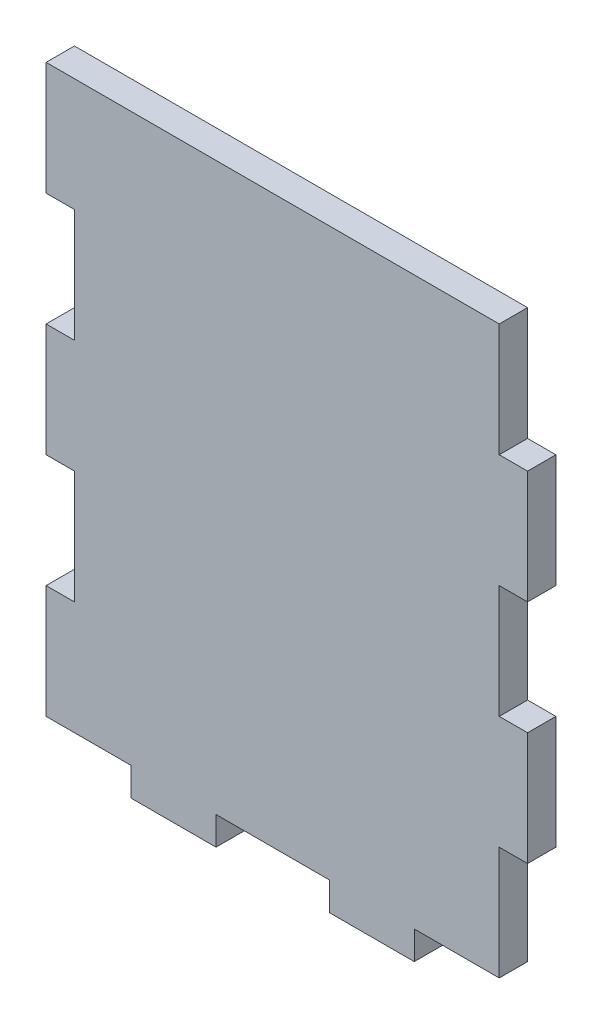
ISO-10303-21;
HEADER;
FILE_DESCRIPTION(('STEP AP214'),'2;1');
FILE_NAME('part.step','',(''),(''),'','','');
FILE_SCHEMA(('AUTOMOTIVE_DESIGN { 1 0 10303 214 1 1 1 1 }'));
ENDSEC;
DATA;
#1=APPLICATION_CONTEXT('core data for automotive mechanical design processes');
#2=APPLICATION_PROTOCOL_DEFINITION('international standard','automotive_design',2000,#1);
#3=PRODUCT_CONTEXT('',#1,'mechanical');
#4=PRODUCT('Part','Part','',(#3));
#5=PRODUCT_RELATED_PRODUCT_CATEGORY('part','',(#4));
#6=PRODUCT_DEFINITION_FORMATION('','',#4);
#7=PRODUCT_DEFINITION_CONTEXT('part definition',#1,'design');
#8=PRODUCT_DEFINITION('design','',#6,#7);
#9=PRODUCT_DEFINITION_SHAPE('','',#8);
#10=(LENGTH_UNIT() NAMED_UNIT(*) SI_UNIT(.MILLI.,.METRE.));
#11=(NAMED_UNIT(*) PLANE_ANGLE_UNIT() SI_UNIT($,.RADIAN.));
#12=(NAMED_UNIT(*) SI_UNIT($,.STERADIAN.) SOLID_ANGLE_UNIT());
#13=UNCERTAINTY_MEASURE_WITH_UNIT(LENGTH_MEASURE(1.E-05),#10,'distance_accuracy_value','');
#14=(GEOMETRIC_REPRESENTATION_CONTEXT(3) GLOBAL_UNCERTAINTY_ASSIGNED_CONTEXT((#13)) GLOBAL_UNIT_ASSIGNED_CONTEXT((#10,
#11,#12)) REPRESENTATION_CONTEXT('',''));
#15=CARTESIAN_POINT('',(0.,0.,0.));
#16=DIRECTION('',(0.,0.,1.));
#17=DIRECTION('',(1.,0.,0.));
#18=AXIS2_PLACEMENT_3D('',#15,#16,#17);
#19=CARTESIAN_POINT('',(-50.8,38.1,6.35));
#20=DIRECTION('',(-1.,0.,0.));
#21=DIRECTION('',(0.,0.,1.));
#22=AXIS2_PLACEMENT_3D('',#19,#20,#21);
#23=PLANE('',#22);
#24=DIRECTION('',(0.,1.,0.));
#25=VECTOR('',#24,1.);
#26=CARTESIAN_POINT('',(-50.8,38.1,0.));
#27=LINE('',#26,#25);
#28=CARTESIAN_POINT('',(-50.8,38.1,0.));
#29=VERTEX_POINT('',#28);
#30=CARTESIAN_POINT('',(-50.8,63.5,0.));
#31=VERTEX_POINT('',#30);
#32=EDGE_CURVE('E252',#29,#31,#27,.T.);
#33=ORIENTED_EDGE('',*,*,#32,.F.);
#34=DIRECTION('',(0.,0.,-1.));
#35=VECTOR('',#34,1.);
#36=CARTESIAN_POINT('',(-50.8,38.1,6.35));
#37=LINE('',#36,#35);
#38=CARTESIAN_POINT('',(-50.8,38.1,6.35));
#39=VERTEX_POINT('',#38);
#40=EDGE_CURVE('E11',#39,#29,#37,.T.);
#41=ORIENTED_EDGE('',*,*,#40,.F.);
#42=DIRECTION('',(0.,1.,0.));
#43=VECTOR('',#42,1.);
#44=CARTESIAN_POINT('',(-50.8,38.1,6.35));
#45=LINE('',#44,#43);
#46=CARTESIAN_POINT('',(-50.8,63.5,6.35));
#47=VERTEX_POINT('',#46);
#48=EDGE_CURVE('E322',#39,#47,#45,.T.);
#49=ORIENTED_EDGE('',*,*,#48,.T.);
#50=DIRECTION('',(0.,0.,-1.));
#51=VECTOR('',#50,1.);
#52=CARTESIAN_POINT('',(-50.8,63.5,6.35));
#53=LINE('',#52,#51);
#54=EDGE_CURVE('E36',#47,#31,#53,.T.);
#55=ORIENTED_EDGE('',*,*,#54,.T.);
#56=EDGE_LOOP('',(#33,#41,#49,#55));
#57=FACE_BOUND('',#56,.T.);
#58=ADVANCED_FACE('F33',(#57),#23,.T.);
#59=CARTESIAN_POINT('',(-50.8,38.1,6.35));
#60=DIRECTION('',(0.,1.,0.));
#61=DIRECTION('',(0.,0.,1.));
#62=AXIS2_PLACEMENT_3D('',#59,#60,#61);
#63=PLANE('',#62);
#64=DIRECTION('',(1.,0.,0.));
#65=VECTOR('',#64,1.);
#66=CARTESIAN_POINT('',(-50.8,38.1,0.));
#67=LINE('',#66,#65);
#68=CARTESIAN_POINT('',(-44.45,38.1,0.));
#69=VERTEX_POINT('',#68);
#70=EDGE_CURVE('E138',#29,#69,#67,.T.);
#71=ORIENTED_EDGE('',*,*,#70,.T.);
#72=DIRECTION('',(0.,0.,-1.));
#73=VECTOR('',#72,1.);
#74=CARTESIAN_POINT('',(-44.45,38.1,6.35));
#75=LINE('',#74,#73);
#76=CARTESIAN_POINT('',(-44.45,38.1,6.35));
#77=VERTEX_POINT('',#76);
#78=EDGE_CURVE('E42',#77,#69,#75,.T.);
#79=ORIENTED_EDGE('',*,*,#78,.F.);
#80=DIRECTION('',(1.,0.,0.));
#81=VECTOR('',#80,1.);
#82=CARTESIAN_POINT('',(-50.8,38.1,6.35));
#83=LINE('',#82,#81);
#84=EDGE_CURVE('E231',#39,#77,#83,.T.);
#85=ORIENTED_EDGE('',*,*,#84,.F.);
#86=ORIENTED_EDGE('',*,*,#40,.T.);
#87=EDGE_LOOP('',(#71,#79,#85,#86));
#88=FACE_BOUND('',#87,.T.);
#89=ADVANCED_FACE('F548',(#88),#63,.F.);
#90=CARTESIAN_POINT('',(-44.45,38.1,6.35));
#91=DIRECTION('',(1.,0.,0.));
#92=DIRECTION('',(0.,0.,-1.));
#93=AXIS2_PLACEMENT_3D('',#90,#91,#92);
#94=PLANE('',#93);
#95=DIRECTION('',(0.,-1.,0.));
#96=VECTOR('',#95,1.);
#97=CARTESIAN_POINT('',(-44.45,38.1,0.));
#98=LINE('',#97,#96);
#99=CARTESIAN_POINT('',(-44.45,12.7,0.));
#100=VERTEX_POINT('',#99);
#101=EDGE_CURVE('E238',#69,#100,#98,.T.);
#102=ORIENTED_EDGE('',*,*,#101,.T.);
#103=DIRECTION('',(0.,0.,-1.));
#104=VECTOR('',#103,1.);
#105=CARTESIAN_POINT('',(-44.45,12.7,6.35));
#106=LINE('',#105,#104);
#107=CARTESIAN_POINT('',(-44.45,12.7,6.35));
#108=VERTEX_POINT('',#107);
#109=EDGE_CURVE('E235',#108,#100,#106,.T.);
#110=ORIENTED_EDGE('',*,*,#109,.F.);
#111=DIRECTION('',(0.,-1.,0.));
#112=VECTOR('',#111,1.);
#113=CARTESIAN_POINT('',(-44.45,38.1,6.35));
#114=LINE('',#113,#112);
#115=EDGE_CURVE('E223',#77,#108,#114,.T.);
#116=ORIENTED_EDGE('',*,*,#115,.F.);
#117=ORIENTED_EDGE('',*,*,#78,.T.);
#118=EDGE_LOOP('',(#102,#110,#116,#117));
#119=FACE_BOUND('',#118,.T.);
#120=ADVANCED_FACE('F236',(#119),#94,.F.);
#121=CARTESIAN_POINT('',(-50.8,12.7,6.35));
#122=DIRECTION('',(0.,1.,0.));
#123=DIRECTION('',(0.,0.,1.));
#124=AXIS2_PLACEMENT_3D('',#121,#122,#123);
#125=PLANE('',#124);
#126=DIRECTION('',(1.,0.,0.));
#127=VECTOR('',#126,1.);
#128=CARTESIAN_POINT('',(-50.8,12.7,0.));
#129=LINE('',#128,#127);
#130=CARTESIAN_POINT('',(-50.8,12.7,0.));
#131=VERTEX_POINT('',#130);
#132=EDGE_CURVE('E319',#131,#100,#129,.T.);
#133=ORIENTED_EDGE('',*,*,#132,.F.);
#134=DIRECTION('',(0.,0.,-1.));
#135=VECTOR('',#134,1.);
#136=CARTESIAN_POINT('',(-50.8,12.7,6.35));
#137=LINE('',#136,#135);
#138=CARTESIAN_POINT('',(-50.8,12.7,6.35));
#139=VERTEX_POINT('',#138);
#140=EDGE_CURVE('E242',#139,#131,#137,.T.);
#141=ORIENTED_EDGE('',*,*,#140,.F.);
#142=DIRECTION('',(1.,0.,0.));
#143=VECTOR('',#142,1.);
#144=CARTESIAN_POINT('',(-50.8,12.7,6.35));
#145=LINE('',#144,#143);
#146=EDGE_CURVE('E229',#139,#108,#145,.T.);
#147=ORIENTED_EDGE('',*,*,#146,.T.);
#148=ORIENTED_EDGE('',*,*,#109,.T.);
#149=EDGE_LOOP('',(#133,#141,#147,#148));
#150=FACE_BOUND('',#149,.T.);
#151=ADVANCED_FACE('F244',(#150),#125,.T.);
#152=CARTESIAN_POINT('',(-50.8,-12.7,6.35));
#153=DIRECTION('',(-1.,0.,0.));
#154=DIRECTION('',(0.,0.,1.));
#155=AXIS2_PLACEMENT_3D('',#152,#153,#154);
#156=PLANE('',#155);
#157=DIRECTION('',(0.,1.,0.));
#158=VECTOR('',#157,1.);
#159=CARTESIAN_POINT('',(-50.8,-12.7,0.));
#160=LINE('',#159,#158);
#161=CARTESIAN_POINT('',(-50.8,-12.7,0.));
#162=VERTEX_POINT('',#161);
#163=EDGE_CURVE('E316',#162,#131,#160,.T.);
#164=ORIENTED_EDGE('',*,*,#163,.F.);
#165=DIRECTION('',(0.,0.,-1.));
#166=VECTOR('',#165,1.);
#167=CARTESIAN_POINT('',(-50.8,-12.7,6.35));
#168=LINE('',#167,#166);
#169=CARTESIAN_POINT('',(-50.8,-12.7,6.35));
#170=VERTEX_POINT('',#169);
#171=EDGE_CURVE('E326',#170,#162,#168,.T.);
#172=ORIENTED_EDGE('',*,*,#171,.F.);
#173=DIRECTION('',(0.,1.,0.));
#174=VECTOR('',#173,1.);
#175=CARTESIAN_POINT('',(-50.8,-12.7,6.35));
#176=LINE('',#175,#174);
#177=EDGE_CURVE('E245',#170,#139,#176,.T.);
#178=ORIENTED_EDGE('',*,*,#177,.T.);
#179=ORIENTED_EDGE('',*,*,#140,.T.);
#180=EDGE_LOOP('',(#164,#172,#178,#179));
#181=FACE_BOUND('',#180,.T.);
#182=ADVANCED_FACE('F387',(#181),#156,.T.);
#183=CARTESIAN_POINT('',(-50.8,-12.7,6.35));
#184=DIRECTION('',(0.,1.,0.));
#185=DIRECTION('',(0.,0.,1.));
#186=AXIS2_PLACEMENT_3D('',#183,#184,#185);
#187=PLANE('',#186);
#188=DIRECTION('',(1.,0.,0.));
#189=VECTOR('',#188,1.);
#190=CARTESIAN_POINT('',(-50.8,-12.7,0.));
#191=LINE('',#190,#189);
#192=CARTESIAN_POINT('',(-44.45,-12.7,0.));
#193=VERTEX_POINT('',#192);
#194=EDGE_CURVE('E314',#162,#193,#191,.T.);
#195=ORIENTED_EDGE('',*,*,#194,.T.);
#196=DIRECTION('',(0.,0.,-1.));
#197=VECTOR('',#196,1.);
#198=CARTESIAN_POINT('',(-44.45,-12.7,6.35));
#199=LINE('',#198,#197);
#200=CARTESIAN_POINT('',(-44.45,-12.7,6.35));
#201=VERTEX_POINT('',#200);
#202=EDGE_CURVE('E328',#201,#193,#199,.T.);
#203=ORIENTED_EDGE('',*,*,#202,.F.);
#204=DIRECTION('',(1.,0.,0.));
#205=VECTOR('',#204,1.);
#206=CARTESIAN_POINT('',(-50.8,-12.7,6.35));
#207=LINE('',#206,#205);
#208=EDGE_CURVE('E247',#170,#201,#207,.T.);
#209=ORIENTED_EDGE('',*,*,#208,.F.);
#210=ORIENTED_EDGE('',*,*,#171,.T.);
#211=EDGE_LOOP('',(#195,#203,#209,#210));
#212=FACE_BOUND('',#211,.T.);
#213=ADVANCED_FACE('F395',(#212),#187,.F.);
#214=CARTESIAN_POINT('',(-44.45,-12.7,6.35));
#215=DIRECTION('',(1.,0.,0.));
#216=DIRECTION('',(0.,1.,0.));
#217=AXIS2_PLACEMENT_3D('',#214,#215,#216);
#218=PLANE('',#217);
#219=DIRECTION('',(0.,-1.,0.));
#220=VECTOR('',#219,1.);
#221=CARTESIAN_POINT('',(-44.45,-12.7,0.));
#222=LINE('',#221,#220);
#223=CARTESIAN_POINT('',(-44.45,-38.1,0.));
#224=VERTEX_POINT('',#223);
#225=EDGE_CURVE('E311',#193,#224,#222,.T.);
#226=ORIENTED_EDGE('',*,*,#225,.T.);
#227=DIRECTION('',(0.,0.,-1.));
#228=VECTOR('',#227,1.);
#229=CARTESIAN_POINT('',(-44.45,-38.1,6.35));
#230=LINE('',#229,#228);
#231=CARTESIAN_POINT('',(-44.45,-38.1,6.35));
#232=VERTEX_POINT('',#231);
#233=EDGE_CURVE('E331',#232,#224,#230,.T.);
#234=ORIENTED_EDGE('',*,*,#233,.F.);
#235=DIRECTION('',(0.,-1.,0.));
#236=VECTOR('',#235,1.);
#237=CARTESIAN_POINT('',(-44.45,-12.7,6.35));
#238=LINE('',#237,#236);
#239=EDGE_CURVE('E392',#201,#232,#238,.T.);
#240=ORIENTED_EDGE('',*,*,#239,.F.);
#241=ORIENTED_EDGE('',*,*,#202,.T.);
#242=EDGE_LOOP('',(#226,#234,#240,#241));
#243=FACE_BOUND('',#242,.T.);
#244=ADVANCED_FACE('F397',(#243),#218,.F.);
#245=CARTESIAN_POINT('',(-50.8,-38.1,6.35));
#246=DIRECTION('',(0.,1.,0.));
#247=DIRECTION('',(0.,0.,1.));
#248=AXIS2_PLACEMENT_3D('',#245,#246,#247);
#249=PLANE('',#248);
#250=DIRECTION('',(1.,0.,0.));
#251=VECTOR('',#250,1.);
#252=CARTESIAN_POINT('',(-50.8,-38.1,0.));
#253=LINE('',#252,#251);
#254=CARTESIAN_POINT('',(-50.8,-38.1,0.));
#255=VERTEX_POINT('',#254);
#256=EDGE_CURVE('E308',#255,#224,#253,.T.);
#257=ORIENTED_EDGE('',*,*,#256,.F.);
#258=DIRECTION('',(0.,0.,-1.));
#259=VECTOR('',#258,1.);
#260=CARTESIAN_POINT('',(-50.8,-38.1,6.35));
#261=LINE('',#260,#259);
#262=CARTESIAN_POINT('',(-50.8,-38.1,6.35));
#263=VERTEX_POINT('',#262);
#264=EDGE_CURVE('E333',#263,#255,#261,.T.);
#265=ORIENTED_EDGE('',*,*,#264,.F.);
#266=DIRECTION('',(1.,0.,0.));
#267=VECTOR('',#266,1.);
#268=CARTESIAN_POINT('',(-50.8,-38.1,6.35));
#269=LINE('',#268,#267);
#270=EDGE_CURVE('E399',#263,#232,#269,.T.);
#271=ORIENTED_EDGE('',*,*,#270,.T.);
#272=ORIENTED_EDGE('',*,*,#233,.T.);
#273=EDGE_LOOP('',(#257,#265,#271,#272));
#274=FACE_BOUND('',#273,.T.);
#275=ADVANCED_FACE('F537',(#274),#249,.T.);
#276=CARTESIAN_POINT('',(-50.8,-63.5,6.35));
#277=DIRECTION('',(-1.,0.,0.));
#278=DIRECTION('',(0.,0.,1.));
#279=AXIS2_PLACEMENT_3D('',#276,#277,#278);
#280=PLANE('',#279);
#281=DIRECTION('',(0.,1.,0.));
#282=VECTOR('',#281,1.);
#283=CARTESIAN_POINT('',(-50.8,-63.5,0.));
#284=LINE('',#283,#282);
#285=CARTESIAN_POINT('',(-50.8,-63.5,0.));
#286=VERTEX_POINT('',#285);
#287=EDGE_CURVE('E305',#286,#255,#284,.T.);
#288=ORIENTED_EDGE('',*,*,#287,.F.);
#289=DIRECTION('',(0.,0.,-1.));
#290=VECTOR('',#289,1.);
#291=CARTESIAN_POINT('',(-50.8,-63.5,6.35));
#292=LINE('',#291,#290);
#293=CARTESIAN_POINT('',(-50.8,-63.5,6.35));
#294=VERTEX_POINT('',#293);
#295=EDGE_CURVE('E335',#294,#286,#292,.T.);
#296=ORIENTED_EDGE('',*,*,#295,.F.);
#297=DIRECTION('',(0.,1.,0.));
#298=VECTOR('',#297,1.);
#299=CARTESIAN_POINT('',(-50.8,-63.5,6.35));
#300=LINE('',#299,#298);
#301=EDGE_CURVE('E401',#294,#263,#300,.T.);
#302=ORIENTED_EDGE('',*,*,#301,.T.);
#303=ORIENTED_EDGE('',*,*,#264,.T.);
#304=EDGE_LOOP('',(#288,#296,#302,#303));
#305=FACE_BOUND('',#304,.T.);
#306=ADVANCED_FACE('F534',(#305),#280,.T.);
#307=CARTESIAN_POINT('',(-50.8,-63.5,6.35));
#308=DIRECTION('',(0.,1.,0.));
#309=DIRECTION('',(0.,0.,1.));
#310=AXIS2_PLACEMENT_3D('',#307,#308,#309);
#311=PLANE('',#310);
#312=DIRECTION('',(1.,0.,0.));
#313=VECTOR('',#312,1.);
#314=CARTESIAN_POINT('',(-50.8,-63.5,0.));
#315=LINE('',#314,#313);
#316=CARTESIAN_POINT('',(-31.75,-63.5,0.));
#317=VERTEX_POINT('',#316);
#318=EDGE_CURVE('E303',#286,#317,#315,.T.);
#319=ORIENTED_EDGE('',*,*,#318,.T.);
#320=DIRECTION('',(0.,0.,-1.));
#321=VECTOR('',#320,1.);
#322=CARTESIAN_POINT('',(-31.75,-63.5,6.35));
#323=LINE('',#322,#321);
#324=CARTESIAN_POINT('',(-31.75,-63.5,6.35));
#325=VERTEX_POINT('',#324);
#326=EDGE_CURVE('E337',#325,#317,#323,.T.);
#327=ORIENTED_EDGE('',*,*,#326,.F.);
#328=DIRECTION('',(1.,0.,0.));
#329=VECTOR('',#328,1.);
#330=CARTESIAN_POINT('',(-50.8,-63.5,6.35));
#331=LINE('',#330,#329);
#332=EDGE_CURVE('E406',#294,#325,#331,.T.);
#333=ORIENTED_EDGE('',*,*,#332,.F.);
#334=ORIENTED_EDGE('',*,*,#295,.T.);
#335=EDGE_LOOP('',(#319,#327,#333,#334));
#336=FACE_BOUND('',#335,.T.);
#337=ADVANCED_FACE('F530',(#336),#311,.F.);
#338=CARTESIAN_POINT('',(-31.75,-63.5,6.35));
#339=DIRECTION('',(1.,0.,0.));
#340=DIRECTION('',(0.,0.,-1.));
#341=AXIS2_PLACEMENT_3D('',#338,#339,#340);
#342=PLANE('',#341);
#343=DIRECTION('',(0.,-1.,0.));
#344=VECTOR('',#343,1.);
#345=CARTESIAN_POINT('',(-31.75,-63.5,0.));
#346=LINE('',#345,#344);
#347=CARTESIAN_POINT('',(-31.75,-69.85,0.));
#348=VERTEX_POINT('',#347);
#349=EDGE_CURVE('E301',#317,#348,#346,.T.);
#350=ORIENTED_EDGE('',*,*,#349,.T.);
#351=DIRECTION('',(0.,0.,-1.));
#352=VECTOR('',#351,1.);
#353=CARTESIAN_POINT('',(-31.75,-69.85,6.35));
#354=LINE('',#353,#352);
#355=CARTESIAN_POINT('',(-31.75,-69.85,6.35));
#356=VERTEX_POINT('',#355);
#357=EDGE_CURVE('E340',#356,#348,#354,.T.);
#358=ORIENTED_EDGE('',*,*,#357,.F.);
#359=DIRECTION('',(0.,-1.,0.));
#360=VECTOR('',#359,1.);
#361=CARTESIAN_POINT('',(-31.75,-63.5,6.35));
#362=LINE('',#361,#360);
#363=EDGE_CURVE('E408',#325,#356,#362,.T.);
#364=ORIENTED_EDGE('',*,*,#363,.F.);
#365=ORIENTED_EDGE('',*,*,#326,.T.);
#366=EDGE_LOOP('',(#350,#358,#364,#365));
#367=FACE_BOUND('',#366,.T.);
#368=ADVANCED_FACE('F526',(#367),#342,.F.);
#369=CARTESIAN_POINT('',(-31.75,-69.85,6.35));
#370=DIRECTION('',(0.,1.,0.));
#371=DIRECTION('',(0.,0.,1.));
#372=AXIS2_PLACEMENT_3D('',#369,#370,#371);
#373=PLANE('',#372);
#374=DIRECTION('',(1.,0.,0.));
#375=VECTOR('',#374,1.);
#376=CARTESIAN_POINT('',(-31.75,-69.85,0.));
#377=LINE('',#376,#375);
#378=CARTESIAN_POINT('',(-12.7,-69.85,0.));
#379=VERTEX_POINT('',#378);
#380=EDGE_CURVE('E298',#348,#379,#377,.T.);
#381=ORIENTED_EDGE('',*,*,#380,.T.);
#382=DIRECTION('',(0.,0.,-1.));
#383=VECTOR('',#382,1.);
#384=CARTESIAN_POINT('',(-12.7,-69.85,6.35));
#385=LINE('',#384,#383);
#386=CARTESIAN_POINT('',(-12.7,-69.85,6.35));
#387=VERTEX_POINT('',#386);
#388=EDGE_CURVE('E343',#387,#379,#385,.T.);
#389=ORIENTED_EDGE('',*,*,#388,.F.);
#390=DIRECTION('',(1.,0.,0.));
#391=VECTOR('',#390,1.);
#392=CARTESIAN_POINT('',(-31.75,-69.85,6.35));
#393=LINE('',#392,#391);
#394=EDGE_CURVE('E410',#356,#387,#393,.T.);
#395=ORIENTED_EDGE('',*,*,#394,.F.);
#396=ORIENTED_EDGE('',*,*,#357,.T.);
#397=EDGE_LOOP('',(#381,#389,#395,#396));
#398=FACE_BOUND('',#397,.T.);
#399=ADVANCED_FACE('F521',(#398),#373,.F.);
#400=CARTESIAN_POINT('',(-12.7,-63.5,6.35));
#401=DIRECTION('',(1.,0.,0.));
#402=DIRECTION('',(0.,0.,-1.));
#403=AXIS2_PLACEMENT_3D('',#400,#401,#402);
#404=PLANE('',#403);
#405=DIRECTION('',(0.,-1.,0.));
#406=VECTOR('',#405,1.);
#407=CARTESIAN_POINT('',(-12.7,-63.5,0.));
#408=LINE('',#407,#406);
#409=CARTESIAN_POINT('',(-12.7,-63.5,0.));
#410=VERTEX_POINT('',#409);
#411=EDGE_CURVE('E295',#410,#379,#408,.T.);
#412=ORIENTED_EDGE('',*,*,#411,.F.);
#413=DIRECTION('',(0.,0.,-1.));
#414=VECTOR('',#413,1.);
#415=CARTESIAN_POINT('',(-12.7,-63.5,6.35));
#416=LINE('',#415,#414);
#417=CARTESIAN_POINT('',(-12.7,-63.5,6.35));
#418=VERTEX_POINT('',#417);
#419=EDGE_CURVE('E345',#418,#410,#416,.T.);
#420=ORIENTED_EDGE('',*,*,#419,.F.);
#421=DIRECTION('',(0.,-1.,0.));
#422=VECTOR('',#421,1.);
#423=CARTESIAN_POINT('',(-12.7,-63.5,6.35));
#424=LINE('',#423,#422);
#425=EDGE_CURVE('E412',#418,#387,#424,.T.);
#426=ORIENTED_EDGE('',*,*,#425,.T.);
#427=ORIENTED_EDGE('',*,*,#388,.T.);
#428=EDGE_LOOP('',(#412,#420,#426,#427));
#429=FACE_BOUND('',#428,.T.);
#430=ADVANCED_FACE('F515',(#429),#404,.T.);
#431=CARTESIAN_POINT('',(-12.7,-63.5,6.35));
#432=DIRECTION('',(0.,1.,0.));
#433=DIRECTION('',(0.,0.,1.));
#434=AXIS2_PLACEMENT_3D('',#431,#432,#433);
#435=PLANE('',#434);
#436=DIRECTION('',(1.,0.,0.));
#437=VECTOR('',#436,1.);
#438=CARTESIAN_POINT('',(-12.7,-63.5,0.));
#439=LINE('',#438,#437);
#440=CARTESIAN_POINT('',(12.7,-63.5,0.));
#441=VERTEX_POINT('',#440);
#442=EDGE_CURVE('E293',#410,#441,#439,.T.);
#443=ORIENTED_EDGE('',*,*,#442,.T.);
#444=DIRECTION('',(0.,0.,-1.));
#445=VECTOR('',#444,1.);
#446=CARTESIAN_POINT('',(12.7,-63.5,6.35));
#447=LINE('',#446,#445);
#448=CARTESIAN_POINT('',(12.7,-63.5,6.35));
#449=VERTEX_POINT('',#448);
#450=EDGE_CURVE('E347',#449,#441,#447,.T.);
#451=ORIENTED_EDGE('',*,*,#450,.F.);
#452=DIRECTION('',(1.,0.,0.));
#453=VECTOR('',#452,1.);
#454=CARTESIAN_POINT('',(-12.7,-63.5,6.35));
#455=LINE('',#454,#453);
#456=EDGE_CURVE('E415',#418,#449,#455,.T.);
#457=ORIENTED_EDGE('',*,*,#456,.F.);
#458=ORIENTED_EDGE('',*,*,#419,.T.);
#459=EDGE_LOOP('',(#443,#451,#457,#458));
#460=FACE_BOUND('',#459,.T.);
#461=ADVANCED_FACE('F512',(#460),#435,.F.);
#462=CARTESIAN_POINT('',(12.7,-63.5,6.35));
#463=DIRECTION('',(1.,0.,0.));
#464=DIRECTION('',(0.,1.,0.));
#465=AXIS2_PLACEMENT_3D('',#462,#463,#464);
#466=PLANE('',#465);
#467=DIRECTION('',(0.,-1.,0.));
#468=VECTOR('',#467,1.);
#469=CARTESIAN_POINT('',(12.7,-63.5,0.));
#470=LINE('',#469,#468);
#471=CARTESIAN_POINT('',(12.7,-69.85,0.));
#472=VERTEX_POINT('',#471);
#473=EDGE_CURVE('E291',#441,#472,#470,.T.);
#474=ORIENTED_EDGE('',*,*,#473,.T.);
#475=DIRECTION('',(0.,0.,-1.));
#476=VECTOR('',#475,1.);
#477=CARTESIAN_POINT('',(12.7,-69.85,6.35));
#478=LINE('',#477,#476);
#479=CARTESIAN_POINT('',(12.7,-69.85,6.35));
#480=VERTEX_POINT('',#479);
#481=EDGE_CURVE('E350',#480,#472,#478,.T.);
#482=ORIENTED_EDGE('',*,*,#481,.F.);
#483=DIRECTION('',(0.,-1.,0.));
#484=VECTOR('',#483,1.);
#485=CARTESIAN_POINT('',(12.7,-63.5,6.35));
#486=LINE('',#485,#484);
#487=EDGE_CURVE('E417',#449,#480,#486,.T.);
#488=ORIENTED_EDGE('',*,*,#487,.F.);
#489=ORIENTED_EDGE('',*,*,#450,.T.);
#490=EDGE_LOOP('',(#474,#482,#488,#489));
#491=FACE_BOUND('',#490,.T.);
#492=ADVANCED_FACE('F507',(#491),#466,.F.);
#493=CARTESIAN_POINT('',(12.7,-69.85,6.35));
#494=DIRECTION('',(0.,1.,0.));
#495=DIRECTION('',(-1.,0.,0.));
#496=AXIS2_PLACEMENT_3D('',#493,#494,#495);
#497=PLANE('',#496);
#498=DIRECTION('',(1.,0.,0.));
#499=VECTOR('',#498,1.);
#500=CARTESIAN_POINT('',(12.7,-69.85,0.));
#501=LINE('',#500,#499);
#502=CARTESIAN_POINT('',(31.75,-69.85,0.));
#503=VERTEX_POINT('',#502);
#504=EDGE_CURVE('E288',#472,#503,#501,.T.);
#505=ORIENTED_EDGE('',*,*,#504,.T.);
#506=DIRECTION('',(0.,0.,-1.));
#507=VECTOR('',#506,1.);
#508=CARTESIAN_POINT('',(31.75,-69.85,6.35));
#509=LINE('',#508,#507);
#510=CARTESIAN_POINT('',(31.75,-69.85,6.35));
#511=VERTEX_POINT('',#510);
#512=EDGE_CURVE('E353',#511,#503,#509,.T.);
#513=ORIENTED_EDGE('',*,*,#512,.F.);
#514=DIRECTION('',(1.,0.,0.));
#515=VECTOR('',#514,1.);
#516=CARTESIAN_POINT('',(12.7,-69.85,6.35));
#517=LINE('',#516,#515);
#518=EDGE_CURVE('E419',#480,#511,#517,.T.);
#519=ORIENTED_EDGE('',*,*,#518,.F.);
#520=ORIENTED_EDGE('',*,*,#481,.T.);
#521=EDGE_LOOP('',(#505,#513,#519,#520));
#522=FACE_BOUND('',#521,.T.);
#523=ADVANCED_FACE('F501',(#522),#497,.F.);
#524=CARTESIAN_POINT('',(31.75,-63.5,6.35));
#525=DIRECTION('',(1.,0.,0.));
#526=DIRECTION('',(0.,0.,-1.));
#527=AXIS2_PLACEMENT_3D('',#524,#525,#526);
#528=PLANE('',#527);
#529=DIRECTION('',(0.,-1.,0.));
#530=VECTOR('',#529,1.);
#531=CARTESIAN_POINT('',(31.75,-63.5,0.));
#532=LINE('',#531,#530);
#533=CARTESIAN_POINT('',(31.75,-63.5,0.));
#534=VERTEX_POINT('',#533);
#535=EDGE_CURVE('E285',#534,#503,#532,.T.);
#536=ORIENTED_EDGE('',*,*,#535,.F.);
#537=DIRECTION('',(0.,0.,-1.));
#538=VECTOR('',#537,1.);
#539=CARTESIAN_POINT('',(31.75,-63.5,6.35));
#540=LINE('',#539,#538);
#541=CARTESIAN_POINT('',(31.75,-63.5,6.35));
#542=VERTEX_POINT('',#541);
#543=EDGE_CURVE('E355',#542,#534,#540,.T.);
#544=ORIENTED_EDGE('',*,*,#543,.F.);
#545=DIRECTION('',(0.,-1.,0.));
#546=VECTOR('',#545,1.);
#547=CARTESIAN_POINT('',(31.75,-63.5,6.35));
#548=LINE('',#547,#546);
#549=EDGE_CURVE('E421',#542,#511,#548,.T.);
#550=ORIENTED_EDGE('',*,*,#549,.T.);
#551=ORIENTED_EDGE('',*,*,#512,.T.);
#552=EDGE_LOOP('',(#536,#544,#550,#551));
#553=FACE_BOUND('',#552,.T.);
#554=ADVANCED_FACE('F495',(#553),#528,.T.);
#555=CARTESIAN_POINT('',(31.75,-63.5,6.35));
#556=DIRECTION('',(0.,1.,0.));
#557=DIRECTION('',(0.,0.,1.));
#558=AXIS2_PLACEMENT_3D('',#555,#556,#557);
#559=PLANE('',#558);
#560=DIRECTION('',(1.,0.,0.));
#561=VECTOR('',#560,1.);
#562=CARTESIAN_POINT('',(31.75,-63.5,0.));
#563=LINE('',#562,#561);
#564=CARTESIAN_POINT('',(50.8,-63.5,0.));
#565=VERTEX_POINT('',#564);
#566=EDGE_CURVE('E283',#534,#565,#563,.T.);
#567=ORIENTED_EDGE('',*,*,#566,.T.);
#568=DIRECTION('',(0.,0.,-1.));
#569=VECTOR('',#568,1.);
#570=CARTESIAN_POINT('',(50.8,-63.5,6.35));
#571=LINE('',#570,#569);
#572=CARTESIAN_POINT('',(50.8,-63.5,6.35));
#573=VERTEX_POINT('',#572);
#574=EDGE_CURVE('E357',#573,#565,#571,.T.);
#575=ORIENTED_EDGE('',*,*,#574,.F.);
#576=DIRECTION('',(1.,0.,0.));
#577=VECTOR('',#576,1.);
#578=CARTESIAN_POINT('',(31.75,-63.5,6.35));
#579=LINE('',#578,#577);
#580=EDGE_CURVE('E424',#542,#573,#579,.T.);
#581=ORIENTED_EDGE('',*,*,#580,.F.);
#582=ORIENTED_EDGE('',*,*,#543,.T.);
#583=EDGE_LOOP('',(#567,#575,#581,#582));
#584=FACE_BOUND('',#583,.T.);
#585=ADVANCED_FACE('F538',(#584),#559,.F.);
#586=CARTESIAN_POINT('',(50.8,-63.5,6.35));
#587=DIRECTION('',(-1.,0.,0.));
#588=DIRECTION('',(0.,0.,1.));
#589=AXIS2_PLACEMENT_3D('',#586,#587,#588);
#590=PLANE('',#589);
#591=DIRECTION('',(0.,1.,0.));
#592=VECTOR('',#591,1.);
#593=CARTESIAN_POINT('',(50.8,-63.5,0.));
#594=LINE('',#593,#592);
#595=CARTESIAN_POINT('',(50.8,-38.1,0.));
#596=VERTEX_POINT('',#595);
#597=EDGE_CURVE('E281',#565,#596,#594,.T.);
#598=ORIENTED_EDGE('',*,*,#597,.T.);
#599=DIRECTION('',(0.,0.,-1.));
#600=VECTOR('',#599,1.);
#601=CARTESIAN_POINT('',(50.8,-38.1,6.35));
#602=LINE('',#601,#600);
#603=CARTESIAN_POINT('',(50.8,-38.1,6.35));
#604=VERTEX_POINT('',#603);
#605=EDGE_CURVE('E360',#604,#596,#602,.T.);
#606=ORIENTED_EDGE('',*,*,#605,.F.);
#607=DIRECTION('',(0.,1.,0.));
#608=VECTOR('',#607,1.);
#609=CARTESIAN_POINT('',(50.8,-63.5,6.35));
#610=LINE('',#609,#608);
#611=EDGE_CURVE('E426',#573,#604,#610,.T.);
#612=ORIENTED_EDGE('',*,*,#611,.F.);
#613=ORIENTED_EDGE('',*,*,#574,.T.);
#614=EDGE_LOOP('',(#598,#606,#612,#613));
#615=FACE_BOUND('',#614,.T.);
#616=ADVANCED_FACE('F488',(#615),#590,.F.);
#617=CARTESIAN_POINT('',(50.8,-38.1,6.35));
#618=DIRECTION('',(0.,1.,0.));
#619=DIRECTION('',(0.,0.,1.));
#620=AXIS2_PLACEMENT_3D('',#617,#618,#619);
#621=PLANE('',#620);
#622=DIRECTION('',(1.,0.,0.));
#623=VECTOR('',#622,1.);
#624=CARTESIAN_POINT('',(50.8,-38.1,0.));
#625=LINE('',#624,#623);
#626=CARTESIAN_POINT('',(57.15,-38.1,0.));
#627=VERTEX_POINT('',#626);
#628=EDGE_CURVE('E278',#596,#627,#625,.T.);
#629=ORIENTED_EDGE('',*,*,#628,.T.);
#630=DIRECTION('',(0.,0.,-1.));
#631=VECTOR('',#630,1.);
#632=CARTESIAN_POINT('',(57.15,-38.1,6.35));
#633=LINE('',#632,#631);
#634=CARTESIAN_POINT('',(57.15,-38.1,6.35));
#635=VERTEX_POINT('',#634);
#636=EDGE_CURVE('E363',#635,#627,#633,.T.);
#637=ORIENTED_EDGE('',*,*,#636,.F.);
#638=DIRECTION('',(1.,0.,0.));
#639=VECTOR('',#638,1.);
#640=CARTESIAN_POINT('',(50.8,-38.1,6.35));
#641=LINE('',#640,#639);
#642=EDGE_CURVE('E428',#604,#635,#641,.T.);
#643=ORIENTED_EDGE('',*,*,#642,.F.);
#644=ORIENTED_EDGE('',*,*,#605,.T.);
#645=EDGE_LOOP('',(#629,#637,#643,#644));
#646=FACE_BOUND('',#645,.T.);
#647=ADVANCED_FACE('F484',(#646),#621,.F.);
#648=CARTESIAN_POINT('',(57.15,-12.7,6.35));
#649=DIRECTION('',(1.,0.,0.));
#650=DIRECTION('',(0.,1.,0.));
#651=AXIS2_PLACEMENT_3D('',#648,#649,#650);
#652=PLANE('',#651);
#653=DIRECTION('',(0.,-1.,0.));
#654=VECTOR('',#653,1.);
#655=CARTESIAN_POINT('',(57.15,-12.7,0.));
#656=LINE('',#655,#654);
#657=CARTESIAN_POINT('',(57.15,-12.7,0.));
#658=VERTEX_POINT('',#657);
#659=EDGE_CURVE('E275',#658,#627,#656,.T.);
#660=ORIENTED_EDGE('',*,*,#659,.F.);
#661=DIRECTION('',(0.,0.,-1.));
#662=VECTOR('',#661,1.);
#663=CARTESIAN_POINT('',(57.15,-12.7,6.35));
#664=LINE('',#663,#662);
#665=CARTESIAN_POINT('',(57.15,-12.7,6.35));
#666=VERTEX_POINT('',#665);
#667=EDGE_CURVE('E365',#666,#658,#664,.T.);
#668=ORIENTED_EDGE('',*,*,#667,.F.);
#669=DIRECTION('',(0.,-1.,0.));
#670=VECTOR('',#669,1.);
#671=CARTESIAN_POINT('',(57.15,-12.7,6.35));
#672=LINE('',#671,#670);
#673=EDGE_CURVE('E430',#666,#635,#672,.T.);
#674=ORIENTED_EDGE('',*,*,#673,.T.);
#675=ORIENTED_EDGE('',*,*,#636,.T.);
#676=EDGE_LOOP('',(#660,#668,#674,#675));
#677=FACE_BOUND('',#676,.T.);
#678=ADVANCED_FACE('F479',(#677),#652,.T.);
#679=CARTESIAN_POINT('',(50.8,-12.7,6.35));
#680=DIRECTION('',(0.,1.,0.));
#681=DIRECTION('',(0.,0.,1.));
#682=AXIS2_PLACEMENT_3D('',#679,#680,#681);
#683=PLANE('',#682);
#684=DIRECTION('',(1.,0.,0.));
#685=VECTOR('',#684,1.);
#686=CARTESIAN_POINT('',(50.8,-12.7,0.));
#687=LINE('',#686,#685);
#688=CARTESIAN_POINT('',(50.8,-12.7,0.));
#689=VERTEX_POINT('',#688);
#690=EDGE_CURVE('E272',#689,#658,#687,.T.);
#691=ORIENTED_EDGE('',*,*,#690,.F.);
#692=DIRECTION('',(0.,0.,-1.));
#693=VECTOR('',#692,1.);
#694=CARTESIAN_POINT('',(50.8,-12.7,6.35));
#695=LINE('',#694,#693);
#696=CARTESIAN_POINT('',(50.8,-12.7,6.35));
#697=VERTEX_POINT('',#696);
#698=EDGE_CURVE('E367',#697,#689,#695,.T.);
#699=ORIENTED_EDGE('',*,*,#698,.F.);
#700=DIRECTION('',(1.,0.,0.));
#701=VECTOR('',#700,1.);
#702=CARTESIAN_POINT('',(50.8,-12.7,6.35));
#703=LINE('',#702,#701);
#704=EDGE_CURVE('E433',#697,#666,#703,.T.);
#705=ORIENTED_EDGE('',*,*,#704,.T.);
#706=ORIENTED_EDGE('',*,*,#667,.T.);
#707=EDGE_LOOP('',(#691,#699,#705,#706));
#708=FACE_BOUND('',#707,.T.);
#709=ADVANCED_FACE('F474',(#708),#683,.T.);
#710=CARTESIAN_POINT('',(50.8,-12.7,6.35));
#711=DIRECTION('',(-1.,0.,0.));
#712=DIRECTION('',(0.,0.,1.));
#713=AXIS2_PLACEMENT_3D('',#710,#711,#712);
#714=PLANE('',#713);
#715=DIRECTION('',(0.,1.,0.));
#716=VECTOR('',#715,1.);
#717=CARTESIAN_POINT('',(50.8,-12.7,0.));
#718=LINE('',#717,#716);
#719=CARTESIAN_POINT('',(50.8,12.7,0.));
#720=VERTEX_POINT('',#719);
#721=EDGE_CURVE('E270',#689,#720,#718,.T.);
#722=ORIENTED_EDGE('',*,*,#721,.T.);
#723=DIRECTION('',(0.,0.,-1.));
#724=VECTOR('',#723,1.);
#725=CARTESIAN_POINT('',(50.8,12.7,6.35));
#726=LINE('',#725,#724);
#727=CARTESIAN_POINT('',(50.8,12.7,6.35));
#728=VERTEX_POINT('',#727);
#729=EDGE_CURVE('E369',#728,#720,#726,.T.);
#730=ORIENTED_EDGE('',*,*,#729,.F.);
#731=DIRECTION('',(0.,1.,0.));
#732=VECTOR('',#731,1.);
#733=CARTESIAN_POINT('',(50.8,-12.7,6.35));
#734=LINE('',#733,#732);
#735=EDGE_CURVE('E436',#697,#728,#734,.T.);
#736=ORIENTED_EDGE('',*,*,#735,.F.);
#737=ORIENTED_EDGE('',*,*,#698,.T.);
#738=EDGE_LOOP('',(#722,#730,#736,#737));
#739=FACE_BOUND('',#738,.T.);
#740=ADVANCED_FACE('F471',(#739),#714,.F.);
#741=CARTESIAN_POINT('',(50.8,12.7,6.35));
#742=DIRECTION('',(0.,1.,0.));
#743=DIRECTION('',(0.,0.,1.));
#744=AXIS2_PLACEMENT_3D('',#741,#742,#743);
#745=PLANE('',#744);
#746=DIRECTION('',(1.,0.,0.));
#747=VECTOR('',#746,1.);
#748=CARTESIAN_POINT('',(50.8,12.7,0.));
#749=LINE('',#748,#747);
#750=CARTESIAN_POINT('',(57.15,12.7,0.));
#751=VERTEX_POINT('',#750);
#752=EDGE_CURVE('E267',#720,#751,#749,.T.);
#753=ORIENTED_EDGE('',*,*,#752,.T.);
#754=DIRECTION('',(0.,0.,-1.));
#755=VECTOR('',#754,1.);
#756=CARTESIAN_POINT('',(57.15,12.7,6.35));
#757=LINE('',#756,#755);
#758=CARTESIAN_POINT('',(57.15,12.7,6.35));
#759=VERTEX_POINT('',#758);
#760=EDGE_CURVE('E372',#759,#751,#757,.T.);
#761=ORIENTED_EDGE('',*,*,#760,.F.);
#762=DIRECTION('',(1.,0.,0.));
#763=VECTOR('',#762,1.);
#764=CARTESIAN_POINT('',(50.8,12.7,6.35));
#765=LINE('',#764,#763);
#766=EDGE_CURVE('E438',#728,#759,#765,.T.);
#767=ORIENTED_EDGE('',*,*,#766,.F.);
#768=ORIENTED_EDGE('',*,*,#729,.T.);
#769=EDGE_LOOP('',(#753,#761,#767,#768));
#770=FACE_BOUND('',#769,.T.);
#771=ADVANCED_FACE('F466',(#770),#745,.F.);
#772=CARTESIAN_POINT('',(57.15,38.1,6.35));
#773=DIRECTION('',(1.,0.,0.));
#774=DIRECTION('',(0.,1.,0.));
#775=AXIS2_PLACEMENT_3D('',#772,#773,#774);
#776=PLANE('',#775);
#777=DIRECTION('',(0.,-1.,0.));
#778=VECTOR('',#777,1.);
#779=CARTESIAN_POINT('',(57.15,38.1,0.));
#780=LINE('',#779,#778);
#781=CARTESIAN_POINT('',(57.15,38.1,0.));
#782=VERTEX_POINT('',#781);
#783=EDGE_CURVE('E264',#782,#751,#780,.T.);
#784=ORIENTED_EDGE('',*,*,#783,.F.);
#785=DIRECTION('',(0.,0.,-1.));
#786=VECTOR('',#785,1.);
#787=CARTESIAN_POINT('',(57.15,38.1,6.35));
#788=LINE('',#787,#786);
#789=CARTESIAN_POINT('',(57.15,38.1,6.35));
#790=VERTEX_POINT('',#789);
#791=EDGE_CURVE('E374',#790,#782,#788,.T.);
#792=ORIENTED_EDGE('',*,*,#791,.F.);
#793=DIRECTION('',(0.,-1.,0.));
#794=VECTOR('',#793,1.);
#795=CARTESIAN_POINT('',(57.15,38.1,6.35));
#796=LINE('',#795,#794);
#797=EDGE_CURVE('E440',#790,#759,#796,.T.);
#798=ORIENTED_EDGE('',*,*,#797,.T.);
#799=ORIENTED_EDGE('',*,*,#760,.T.);
#800=EDGE_LOOP('',(#784,#792,#798,#799));
#801=FACE_BOUND('',#800,.T.);
#802=ADVANCED_FACE('F460',(#801),#776,.T.);
#803=CARTESIAN_POINT('',(50.8,38.1,6.35));
#804=DIRECTION('',(0.,1.,0.));
#805=DIRECTION('',(0.,0.,1.));
#806=AXIS2_PLACEMENT_3D('',#803,#804,#805);
#807=PLANE('',#806);
#808=DIRECTION('',(1.,0.,0.));
#809=VECTOR('',#808,1.);
#810=CARTESIAN_POINT('',(50.8,38.1,0.));
#811=LINE('',#810,#809);
#812=CARTESIAN_POINT('',(50.8,38.1,0.));
#813=VERTEX_POINT('',#812);
#814=EDGE_CURVE('E261',#813,#782,#811,.T.);
#815=ORIENTED_EDGE('',*,*,#814,.F.);
#816=DIRECTION('',(0.,0.,-1.));
#817=VECTOR('',#816,1.);
#818=CARTESIAN_POINT('',(50.8,38.1,6.35));
#819=LINE('',#818,#817);
#820=CARTESIAN_POINT('',(50.8,38.1,6.35));
#821=VERTEX_POINT('',#820);
#822=EDGE_CURVE('E376',#821,#813,#819,.T.);
#823=ORIENTED_EDGE('',*,*,#822,.F.);
#824=DIRECTION('',(1.,0.,0.));
#825=VECTOR('',#824,1.);
#826=CARTESIAN_POINT('',(50.8,38.1,6.35));
#827=LINE('',#826,#825);
#828=EDGE_CURVE('E443',#821,#790,#827,.T.);
#829=ORIENTED_EDGE('',*,*,#828,.T.);
#830=ORIENTED_EDGE('',*,*,#791,.T.);
#831=EDGE_LOOP('',(#815,#823,#829,#830));
#832=FACE_BOUND('',#831,.T.);
#833=ADVANCED_FACE('F457',(#832),#807,.T.);
#834=CARTESIAN_POINT('',(50.8,38.1,6.35));
#835=DIRECTION('',(-1.,0.,0.));
#836=DIRECTION('',(0.,0.,1.));
#837=AXIS2_PLACEMENT_3D('',#834,#835,#836);
#838=PLANE('',#837);
#839=DIRECTION('',(0.,1.,0.));
#840=VECTOR('',#839,1.);
#841=CARTESIAN_POINT('',(50.8,38.1,0.));
#842=LINE('',#841,#840);
#843=CARTESIAN_POINT('',(50.8,63.5,0.));
#844=VERTEX_POINT('',#843);
#845=EDGE_CURVE('E258',#813,#844,#842,.T.);
#846=ORIENTED_EDGE('',*,*,#845,.T.);
#847=DIRECTION('',(0.,0.,-1.));
#848=VECTOR('',#847,1.);
#849=CARTESIAN_POINT('',(50.8,63.5,6.35));
#850=LINE('',#849,#848);
#851=CARTESIAN_POINT('',(50.8,63.5,6.35));
#852=VERTEX_POINT('',#851);
#853=EDGE_CURVE('E377',#852,#844,#850,.T.);
#854=ORIENTED_EDGE('',*,*,#853,.F.);
#855=DIRECTION('',(0.,1.,0.));
#856=VECTOR('',#855,1.);
#857=CARTESIAN_POINT('',(50.8,38.1,6.35));
#858=LINE('',#857,#856);
#859=EDGE_CURVE('E446',#821,#852,#858,.T.);
#860=ORIENTED_EDGE('',*,*,#859,.F.);
#861=ORIENTED_EDGE('',*,*,#822,.T.);
#862=EDGE_LOOP('',(#846,#854,#860,#861));
#863=FACE_BOUND('',#862,.T.);
#864=ADVANCED_FACE('F454',(#863),#838,.F.);
#865=CARTESIAN_POINT('',(-50.8,63.5,6.35));
#866=DIRECTION('',(0.,1.,0.));
#867=DIRECTION('',(0.,0.,1.));
#868=AXIS2_PLACEMENT_3D('',#865,#866,#867);
#869=PLANE('',#868);
#870=DIRECTION('',(1.,0.,0.));
#871=VECTOR('',#870,1.);
#872=CARTESIAN_POINT('',(-50.8,63.5,0.));
#873=LINE('',#872,#871);
#874=EDGE_CURVE('E255',#31,#844,#873,.T.);
#875=ORIENTED_EDGE('',*,*,#874,.F.);
#876=ORIENTED_EDGE('',*,*,#54,.F.);
#877=DIRECTION('',(1.,0.,0.));
#878=VECTOR('',#877,1.);
#879=CARTESIAN_POINT('',(-50.8,63.5,6.35));
#880=LINE('',#879,#878);
#881=EDGE_CURVE('E448',#47,#852,#880,.T.);
#882=ORIENTED_EDGE('',*,*,#881,.T.);
#883=ORIENTED_EDGE('',*,*,#853,.T.);
#884=EDGE_LOOP('',(#875,#876,#882,#883));
#885=FACE_BOUND('',#884,.T.);
#886=ADVANCED_FACE('F379',(#885),#869,.T.);
#887=CARTESIAN_POINT('',(0.,0.,6.35));
#888=DIRECTION('',(0.,0.,-1.));
#889=DIRECTION('',(-1.,0.,0.));
#890=AXIS2_PLACEMENT_3D('',#887,#888,#889);
#891=PLANE('',#890);
#892=ORIENTED_EDGE('',*,*,#48,.F.);
#893=ORIENTED_EDGE('',*,*,#84,.T.);
#894=ORIENTED_EDGE('',*,*,#115,.T.);
#895=ORIENTED_EDGE('',*,*,#146,.F.);
#896=ORIENTED_EDGE('',*,*,#177,.F.);
#897=ORIENTED_EDGE('',*,*,#208,.T.);
#898=ORIENTED_EDGE('',*,*,#239,.T.);
#899=ORIENTED_EDGE('',*,*,#270,.F.);
#900=ORIENTED_EDGE('',*,*,#301,.F.);
#901=ORIENTED_EDGE('',*,*,#332,.T.);
#902=ORIENTED_EDGE('',*,*,#363,.T.);
#903=ORIENTED_EDGE('',*,*,#394,.T.);
#904=ORIENTED_EDGE('',*,*,#425,.F.);
#905=ORIENTED_EDGE('',*,*,#456,.T.);
#906=ORIENTED_EDGE('',*,*,#487,.T.);
#907=ORIENTED_EDGE('',*,*,#518,.T.);
#908=ORIENTED_EDGE('',*,*,#549,.F.);
#909=ORIENTED_EDGE('',*,*,#580,.T.);
#910=ORIENTED_EDGE('',*,*,#611,.T.);
#911=ORIENTED_EDGE('',*,*,#642,.T.);
#912=ORIENTED_EDGE('',*,*,#673,.F.);
#913=ORIENTED_EDGE('',*,*,#704,.F.);
#914=ORIENTED_EDGE('',*,*,#735,.T.);
#915=ORIENTED_EDGE('',*,*,#766,.T.);
#916=ORIENTED_EDGE('',*,*,#797,.F.);
#917=ORIENTED_EDGE('',*,*,#828,.F.);
#918=ORIENTED_EDGE('',*,*,#859,.T.);
#919=ORIENTED_EDGE('',*,*,#881,.F.);
#920=EDGE_LOOP('',(#892,#893,#894,#895,#896,#897,#898,#899,#900,#901,#902,#903,#904,#905,#906,
#907,#908,#909,#910,#911,#912,#913,#914,#915,#916,#917,#918,#919));
#921=FACE_BOUND('',#920,.T.);
#922=ADVANCED_FACE('F226',(#921),#891,.F.);
#923=CARTESIAN_POINT('',(0.,0.,0.));
#924=DIRECTION('',(0.,0.,-1.));
#925=DIRECTION('',(-1.,0.,0.));
#926=AXIS2_PLACEMENT_3D('',#923,#924,#925);
#927=PLANE('',#926);
#928=ORIENTED_EDGE('',*,*,#32,.T.);
#929=ORIENTED_EDGE('',*,*,#874,.T.);
#930=ORIENTED_EDGE('',*,*,#845,.F.);
#931=ORIENTED_EDGE('',*,*,#814,.T.);
#932=ORIENTED_EDGE('',*,*,#783,.T.);
#933=ORIENTED_EDGE('',*,*,#752,.F.);
#934=ORIENTED_EDGE('',*,*,#721,.F.);
#935=ORIENTED_EDGE('',*,*,#690,.T.);
#936=ORIENTED_EDGE('',*,*,#659,.T.);
#937=ORIENTED_EDGE('',*,*,#628,.F.);
#938=ORIENTED_EDGE('',*,*,#597,.F.);
#939=ORIENTED_EDGE('',*,*,#566,.F.);
#940=ORIENTED_EDGE('',*,*,#535,.T.);
#941=ORIENTED_EDGE('',*,*,#504,.F.);
#942=ORIENTED_EDGE('',*,*,#473,.F.);
#943=ORIENTED_EDGE('',*,*,#442,.F.);
#944=ORIENTED_EDGE('',*,*,#411,.T.);
#945=ORIENTED_EDGE('',*,*,#380,.F.);
#946=ORIENTED_EDGE('',*,*,#349,.F.);
#947=ORIENTED_EDGE('',*,*,#318,.F.);
#948=ORIENTED_EDGE('',*,*,#287,.T.);
#949=ORIENTED_EDGE('',*,*,#256,.T.);
#950=ORIENTED_EDGE('',*,*,#225,.F.);
#951=ORIENTED_EDGE('',*,*,#194,.F.);
#952=ORIENTED_EDGE('',*,*,#163,.T.);
#953=ORIENTED_EDGE('',*,*,#132,.T.);
#954=ORIENTED_EDGE('',*,*,#101,.F.);
#955=ORIENTED_EDGE('',*,*,#70,.F.);
#956=EDGE_LOOP('',(#928,#929,#930,#931,#932,#933,#934,#935,#936,#937,#938,#939,#940,#941,#942,
#943,#944,#945,#946,#947,#948,#949,#950,#951,#952,#953,#954,#955));
#957=FACE_BOUND('',#956,.T.);
#958=ADVANCED_FACE('F382',(#957),#927,.T.);
#959=CLOSED_SHELL('',(#58,#89,#120,#151,#182,#213,#244,#275,#306,#337,#368,#399,#430,#461,#492,
#523,#554,#585,#616,#647,#678,#709,#740,#771,#802,#833,#864,#886,#922,#958));
#960=MANIFOLD_SOLID_BREP('B2',#959);
#961=ADVANCED_BREP_SHAPE_REPRESENTATION('',(#18,#960),#14);
#962=SHAPE_DEFINITION_REPRESENTATION(#9,#961);
ENDSEC;
END-ISO-10303-21;
